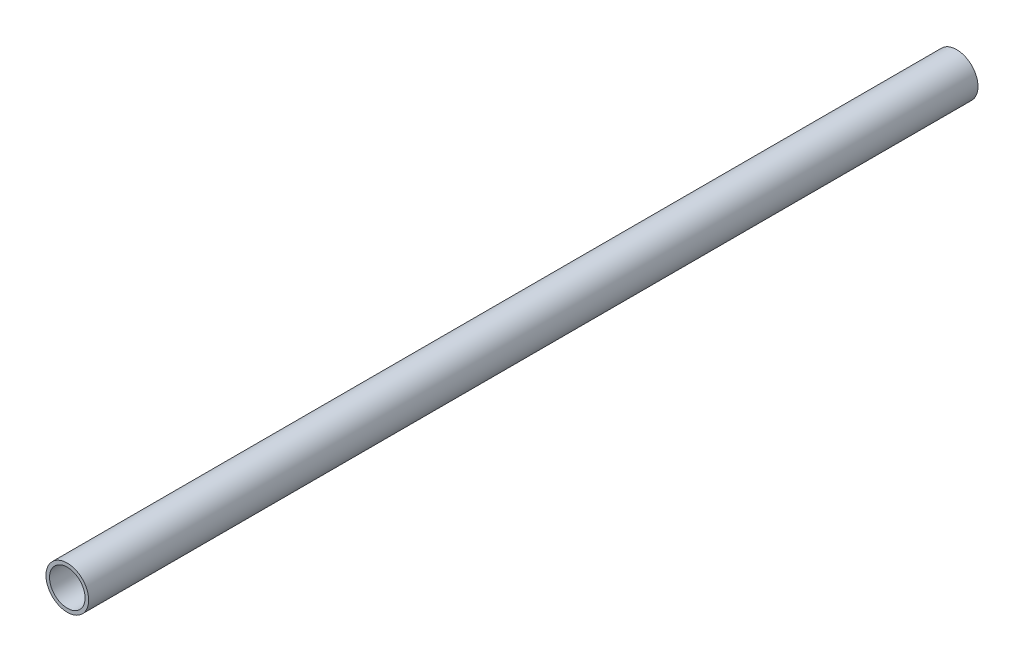
ISO-10303-21;
HEADER;
FILE_DESCRIPTION(('STEP AP214'),'2;1');
FILE_NAME('part.step','',(''),(''),'','','');
FILE_SCHEMA(('AUTOMOTIVE_DESIGN { 1 0 10303 214 1 1 1 1 }'));
ENDSEC;
DATA;
#1=APPLICATION_CONTEXT('core data for automotive mechanical design processes');
#2=APPLICATION_PROTOCOL_DEFINITION('international standard','automotive_design',2000,#1);
#3=PRODUCT_CONTEXT('',#1,'mechanical');
#4=PRODUCT('Part','Part','',(#3));
#5=PRODUCT_RELATED_PRODUCT_CATEGORY('part','',(#4));
#6=PRODUCT_DEFINITION_FORMATION('','',#4);
#7=PRODUCT_DEFINITION_CONTEXT('part definition',#1,'design');
#8=PRODUCT_DEFINITION('design','',#6,#7);
#9=PRODUCT_DEFINITION_SHAPE('','',#8);
#10=(LENGTH_UNIT() NAMED_UNIT(*) SI_UNIT(.MILLI.,.METRE.));
#11=(NAMED_UNIT(*) PLANE_ANGLE_UNIT() SI_UNIT($,.RADIAN.));
#12=(NAMED_UNIT(*) SI_UNIT($,.STERADIAN.) SOLID_ANGLE_UNIT());
#13=UNCERTAINTY_MEASURE_WITH_UNIT(LENGTH_MEASURE(1.E-05),#10,'distance_accuracy_value','');
#14=(GEOMETRIC_REPRESENTATION_CONTEXT(3) GLOBAL_UNCERTAINTY_ASSIGNED_CONTEXT((#13)) GLOBAL_UNIT_ASSIGNED_CONTEXT((#10,
#11,#12)) REPRESENTATION_CONTEXT('',''));
#15=CARTESIAN_POINT('',(0.,0.,0.));
#16=DIRECTION('',(0.,0.,1.));
#17=DIRECTION('',(1.,0.,0.));
#18=AXIS2_PLACEMENT_3D('',#15,#16,#17);
#19=CARTESIAN_POINT('',(0.,0.,500.));
#20=DIRECTION('',(0.,0.,1.));
#21=DIRECTION('',(1.,0.,0.));
#22=AXIS2_PLACEMENT_3D('',#19,#20,#21);
#23=PLANE('',#22);
#24=CARTESIAN_POINT('',(0.,0.,500.));
#25=DIRECTION('',(0.,0.,1.));
#26=DIRECTION('',(1.,0.,0.));
#27=AXIS2_PLACEMENT_3D('',#24,#25,#26);
#28=CIRCLE('',#27,12.);
#29=CARTESIAN_POINT('',(12.,0.,500.));
#30=VERTEX_POINT('',#29);
#31=EDGE_CURVE('E10',#30,#30,#28,.T.);
#32=ORIENTED_EDGE('',*,*,#31,.T.);
#33=EDGE_LOOP('',(#32));
#34=FACE_BOUND('',#33,.T.);
#35=CARTESIAN_POINT('',(0.,0.,500.));
#36=DIRECTION('',(0.,0.,1.));
#37=DIRECTION('',(1.,0.,0.));
#38=AXIS2_PLACEMENT_3D('',#35,#36,#37);
#39=CIRCLE('',#38,10.);
#40=CARTESIAN_POINT('',(10.,0.,500.));
#41=VERTEX_POINT('',#40);
#42=EDGE_CURVE('E48',#41,#41,#39,.T.);
#43=ORIENTED_EDGE('',*,*,#42,.F.);
#44=EDGE_LOOP('',(#43));
#45=FACE_BOUND('',#44,.T.);
#46=ADVANCED_FACE('F40',(#34,#45),#23,.T.);
#47=CARTESIAN_POINT('',(0.,0.,0.));
#48=DIRECTION('',(0.,0.,1.));
#49=DIRECTION('',(1.,0.,0.));
#50=AXIS2_PLACEMENT_3D('',#47,#48,#49);
#51=PLANE('',#50);
#52=CARTESIAN_POINT('',(0.,0.,0.));
#53=DIRECTION('',(0.,0.,1.));
#54=DIRECTION('',(1.,0.,0.));
#55=AXIS2_PLACEMENT_3D('',#52,#53,#54);
#56=CIRCLE('',#55,12.);
#57=CARTESIAN_POINT('',(12.,0.,0.));
#58=VERTEX_POINT('',#57);
#59=EDGE_CURVE('E41',#58,#58,#56,.T.);
#60=ORIENTED_EDGE('',*,*,#59,.F.);
#61=EDGE_LOOP('',(#60));
#62=FACE_BOUND('',#61,.T.);
#63=CARTESIAN_POINT('',(0.,0.,0.));
#64=DIRECTION('',(0.,0.,1.));
#65=DIRECTION('',(1.,0.,0.));
#66=AXIS2_PLACEMENT_3D('',#63,#64,#65);
#67=CIRCLE('',#66,10.);
#68=CARTESIAN_POINT('',(10.,0.,0.));
#69=VERTEX_POINT('',#68);
#70=EDGE_CURVE('E49',#69,#69,#67,.T.);
#71=ORIENTED_EDGE('',*,*,#70,.T.);
#72=EDGE_LOOP('',(#71));
#73=FACE_BOUND('',#72,.T.);
#74=ADVANCED_FACE('F58',(#62,#73),#51,.F.);
#75=CARTESIAN_POINT('',(0.,0.,500.));
#76=DIRECTION('',(0.,0.,-1.));
#77=DIRECTION('',(-1.,0.,0.));
#78=AXIS2_PLACEMENT_3D('',#75,#76,#77);
#79=CYLINDRICAL_SURFACE('',#78,12.);
#80=ORIENTED_EDGE('',*,*,#31,.F.);
#81=EDGE_LOOP('',(#80));
#82=FACE_BOUND('',#81,.T.);
#83=ORIENTED_EDGE('',*,*,#59,.T.);
#84=EDGE_LOOP('',(#83));
#85=FACE_BOUND('',#84,.T.);
#86=ADVANCED_FACE('F39',(#82,#85),#79,.T.);
#87=CARTESIAN_POINT('',(0.,0.,500.));
#88=DIRECTION('',(0.,0.,-1.));
#89=DIRECTION('',(-1.,0.,0.));
#90=AXIS2_PLACEMENT_3D('',#87,#88,#89);
#91=CYLINDRICAL_SURFACE('',#90,10.);
#92=ORIENTED_EDGE('',*,*,#42,.T.);
#93=EDGE_LOOP('',(#92));
#94=FACE_BOUND('',#93,.T.);
#95=ORIENTED_EDGE('',*,*,#70,.F.);
#96=EDGE_LOOP('',(#95));
#97=FACE_BOUND('',#96,.T.);
#98=ADVANCED_FACE('F57',(#94,#97),#91,.F.);
#99=CLOSED_SHELL('',(#46,#74,#86,#98));
#100=MANIFOLD_SOLID_BREP('B2',#99);
#101=ADVANCED_BREP_SHAPE_REPRESENTATION('',(#18,#100),#14);
#102=SHAPE_DEFINITION_REPRESENTATION(#9,#101);
ENDSEC;
END-ISO-10303-21;
